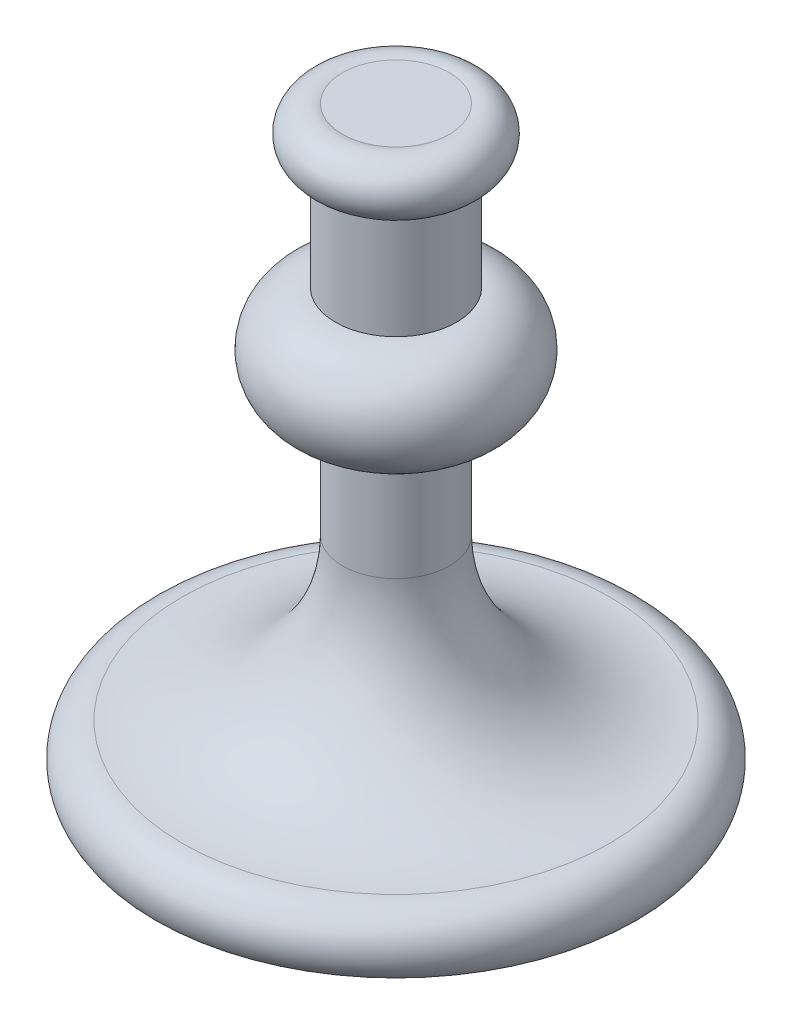
ISO-10303-21;
HEADER;
FILE_DESCRIPTION(('STEP AP214'),'2;1');
FILE_NAME('part.step','',(''),(''),'','','');
FILE_SCHEMA(('AUTOMOTIVE_DESIGN { 1 0 10303 214 1 1 1 1 }'));
ENDSEC;
DATA;
#1=APPLICATION_CONTEXT('core data for automotive mechanical design processes');
#2=APPLICATION_PROTOCOL_DEFINITION('international standard','automotive_design',2000,#1);
#3=PRODUCT_CONTEXT('',#1,'mechanical');
#4=PRODUCT('Part','Part','',(#3));
#5=PRODUCT_RELATED_PRODUCT_CATEGORY('part','',(#4));
#6=PRODUCT_DEFINITION_FORMATION('','',#4);
#7=PRODUCT_DEFINITION_CONTEXT('part definition',#1,'design');
#8=PRODUCT_DEFINITION('design','',#6,#7);
#9=PRODUCT_DEFINITION_SHAPE('','',#8);
#10=(LENGTH_UNIT() NAMED_UNIT(*) SI_UNIT(.MILLI.,.METRE.));
#11=(NAMED_UNIT(*) PLANE_ANGLE_UNIT() SI_UNIT($,.RADIAN.));
#12=(NAMED_UNIT(*) SI_UNIT($,.STERADIAN.) SOLID_ANGLE_UNIT());
#13=UNCERTAINTY_MEASURE_WITH_UNIT(LENGTH_MEASURE(1.E-05),#10,'distance_accuracy_value','');
#14=(GEOMETRIC_REPRESENTATION_CONTEXT(3) GLOBAL_UNCERTAINTY_ASSIGNED_CONTEXT((#13)) GLOBAL_UNIT_ASSIGNED_CONTEXT((#10,
#11,#12)) REPRESENTATION_CONTEXT('',''));
#15=CARTESIAN_POINT('',(0.,0.,0.));
#16=DIRECTION('',(0.,0.,1.));
#17=DIRECTION('',(1.,0.,0.));
#18=AXIS2_PLACEMENT_3D('',#15,#16,#17);
#19=CARTESIAN_POINT('',(0.,89.5958050474617,32.3851753975577));
#20=DIRECTION('',(0.,1.,0.));
#21=DIRECTION('',(0.,0.,1.));
#22=AXIS2_PLACEMENT_3D('',#19,#20,#21);
#23=TOROIDAL_SURFACE('',#22,22.6768111594454,10.);
#24=CARTESIAN_POINT('',(0.,79.5958050474618,32.3851753975577));
#25=DIRECTION('',(0.,1.,0.));
#26=DIRECTION('',(0.,0.,1.));
#27=AXIS2_PLACEMENT_3D('',#24,#25,#26);
#28=CIRCLE('',#27,22.6768111594454);
#29=CARTESIAN_POINT('',(0.,79.5958050474618,55.0619865570031));
#30=VERTEX_POINT('',#29);
#31=EDGE_CURVE('E58',#30,#30,#28,.T.);
#32=ORIENTED_EDGE('',*,*,#31,.T.);
#33=EDGE_LOOP('',(#32));
#34=FACE_BOUND('',#33,.T.);
#35=CARTESIAN_POINT('',(0.,99.2308806577862,32.3851753975577));
#36=DIRECTION('',(0.,1.,0.));
#37=DIRECTION('',(0.,0.,1.));
#38=AXIS2_PLACEMENT_3D('',#35,#36,#37);
#39=CIRCLE('',#38,20.);
#40=CARTESIAN_POINT('',(0.,99.2308806577862,52.3851753975577));
#41=VERTEX_POINT('',#40);
#42=EDGE_CURVE('E10',#41,#41,#39,.T.);
#43=ORIENTED_EDGE('',*,*,#42,.F.);
#44=EDGE_LOOP('',(#43));
#45=FACE_BOUND('',#44,.T.);
#46=ADVANCED_FACE('F33',(#34,#45),#23,.T.);
#47=CARTESIAN_POINT('',(0.,99.2308806577862,52.3851753975577));
#48=DIRECTION('',(0.,1.,0.));
#49=DIRECTION('',(0.,0.,1.));
#50=AXIS2_PLACEMENT_3D('',#47,#48,#49);
#51=PLANE('',#50);
#52=ORIENTED_EDGE('',*,*,#42,.T.);
#53=EDGE_LOOP('',(#52));
#54=FACE_BOUND('',#53,.T.);
#55=ADVANCED_FACE('F76',(#54),#51,.T.);
#56=CARTESIAN_POINT('',(0.,-120.769119342214,32.3851753975577));
#57=DIRECTION('',(0.,-1.,0.));
#58=DIRECTION('',(0.,0.,-1.));
#59=AXIS2_PLACEMENT_3D('',#56,#57,#58);
#60=PLANE('',#59);
#61=CARTESIAN_POINT('',(0.,-120.769119342214,32.3851753975577));
#62=DIRECTION('',(0.,1.,0.));
#63=DIRECTION('',(0.,0.,1.));
#64=AXIS2_PLACEMENT_3D('',#61,#62,#63);
#65=CIRCLE('',#64,90.);
#66=CARTESIAN_POINT('',(0.,-120.769119342214,122.385175397558));
#67=VERTEX_POINT('',#66);
#68=EDGE_CURVE('E39',#67,#67,#65,.T.);
#69=ORIENTED_EDGE('',*,*,#68,.F.);
#70=EDGE_LOOP('',(#69));
#71=FACE_BOUND('',#70,.T.);
#72=ADVANCED_FACE('F80',(#71),#60,.T.);
#73=CARTESIAN_POINT('',(0.,-113.269119342214,32.3851753975577));
#74=DIRECTION('',(0.,1.,0.));
#75=DIRECTION('',(0.,0.,1.));
#76=AXIS2_PLACEMENT_3D('',#73,#74,#75);
#77=TOROIDAL_SURFACE('',#76,80.,12.5);
#78=ORIENTED_EDGE('',*,*,#68,.T.);
#79=EDGE_LOOP('',(#78));
#80=FACE_BOUND('',#79,.T.);
#81=CARTESIAN_POINT('',(0.,-100.769119342214,32.3851753975577));
#82=DIRECTION('',(0.,1.,0.));
#83=DIRECTION('',(0.,0.,1.));
#84=AXIS2_PLACEMENT_3D('',#81,#82,#83);
#85=CIRCLE('',#84,80.);
#86=CARTESIAN_POINT('',(0.,-100.769119342214,112.385175397558));
#87=VERTEX_POINT('',#86);
#88=EDGE_CURVE('E43',#87,#87,#85,.T.);
#89=ORIENTED_EDGE('',*,*,#88,.F.);
#90=EDGE_LOOP('',(#89));
#91=FACE_BOUND('',#90,.T.);
#92=ADVANCED_FACE('F84',(#80,#91),#77,.T.);
#93=CARTESIAN_POINT('',(0.,-40.7691193422138,32.3851753975577));
#94=DIRECTION('',(0.,1.,0.));
#95=DIRECTION('',(0.,0.,1.));
#96=AXIS2_PLACEMENT_3D('',#93,#94,#95);
#97=TOROIDAL_SURFACE('',#96,79.9999999999998,60.);
#98=ORIENTED_EDGE('',*,*,#88,.T.);
#99=EDGE_LOOP('',(#98));
#100=FACE_BOUND('',#99,.T.);
#101=CARTESIAN_POINT('',(0.,-40.7691193422138,32.3851753975577));
#102=DIRECTION('',(0.,1.,0.));
#103=DIRECTION('',(0.,0.,1.));
#104=AXIS2_PLACEMENT_3D('',#101,#102,#103);
#105=CIRCLE('',#104,20.);
#106=CARTESIAN_POINT('',(0.,-40.7691193422138,52.3851753975577));
#107=VERTEX_POINT('',#106);
#108=EDGE_CURVE('E47',#107,#107,#105,.T.);
#109=ORIENTED_EDGE('',*,*,#108,.F.);
#110=EDGE_LOOP('',(#109));
#111=FACE_BOUND('',#110,.T.);
#112=ADVANCED_FACE('F90',(#100,#111),#97,.F.);
#113=CARTESIAN_POINT('',(0.,99.2308806577862,32.3851753975577));
#114=DIRECTION('',(0.,1.,0.));
#115=DIRECTION('',(0.,0.,1.));
#116=AXIS2_PLACEMENT_3D('',#113,#114,#115);
#117=CYLINDRICAL_SURFACE('',#116,20.);
#118=ORIENTED_EDGE('',*,*,#108,.T.);
#119=EDGE_LOOP('',(#118));
#120=FACE_BOUND('',#119,.T.);
#121=CARTESIAN_POINT('',(0.,-0.224252520988177,32.3851753975577));
#122=DIRECTION('',(0.,1.,0.));
#123=DIRECTION('',(0.,0.,1.));
#124=AXIS2_PLACEMENT_3D('',#121,#122,#123);
#125=CIRCLE('',#124,20.);
#126=CARTESIAN_POINT('',(0.,-0.22425252098818,52.3851753975577));
#127=VERTEX_POINT('',#126);
#128=EDGE_CURVE('E52',#127,#127,#125,.T.);
#129=ORIENTED_EDGE('',*,*,#128,.F.);
#130=EDGE_LOOP('',(#129));
#131=FACE_BOUND('',#130,.T.);
#132=ADVANCED_FACE('F72',(#120,#131),#117,.T.);
#133=CARTESIAN_POINT('',(0.,19.5958050474617,32.3851753975577));
#134=DIRECTION('',(0.,1.,0.));
#135=DIRECTION('',(0.,0.,1.));
#136=AXIS2_PLACEMENT_3D('',#133,#134,#135);
#137=TOROIDAL_SURFACE('',#136,22.6768111594454,20.);
#138=ORIENTED_EDGE('',*,*,#128,.T.);
#139=EDGE_LOOP('',(#138));
#140=FACE_BOUND('',#139,.T.);
#141=CARTESIAN_POINT('',(0.,39.5958050474617,32.3851753975577));
#142=DIRECTION('',(0.,1.,0.));
#143=DIRECTION('',(0.,0.,1.));
#144=AXIS2_PLACEMENT_3D('',#141,#142,#143);
#145=CIRCLE('',#144,22.6768111594454);
#146=CARTESIAN_POINT('',(0.,39.5958050474617,55.0619865570031));
#147=VERTEX_POINT('',#146);
#148=EDGE_CURVE('E55',#147,#147,#145,.T.);
#149=ORIENTED_EDGE('',*,*,#148,.F.);
#150=EDGE_LOOP('',(#149));
#151=FACE_BOUND('',#150,.T.);
#152=ADVANCED_FACE('F66',(#140,#151),#137,.T.);
#153=CARTESIAN_POINT('',(0.,99.2308806577862,32.3851753975577));
#154=DIRECTION('',(0.,1.,0.));
#155=DIRECTION('',(0.,0.,1.));
#156=AXIS2_PLACEMENT_3D('',#153,#154,#155);
#157=CYLINDRICAL_SURFACE('',#156,22.6768111594454);
#158=ORIENTED_EDGE('',*,*,#148,.T.);
#159=EDGE_LOOP('',(#158));
#160=FACE_BOUND('',#159,.T.);
#161=ORIENTED_EDGE('',*,*,#31,.F.);
#162=EDGE_LOOP('',(#161));
#163=FACE_BOUND('',#162,.T.);
#164=ADVANCED_FACE('F64',(#160,#163),#157,.T.);
#165=CLOSED_SHELL('',(#46,#55,#72,#92,#112,#132,#152,#164));
#166=MANIFOLD_SOLID_BREP('B2',#165);
#167=ADVANCED_BREP_SHAPE_REPRESENTATION('',(#18,#166),#14);
#168=SHAPE_DEFINITION_REPRESENTATION(#9,#167);
ENDSEC;
END-ISO-10303-21;
